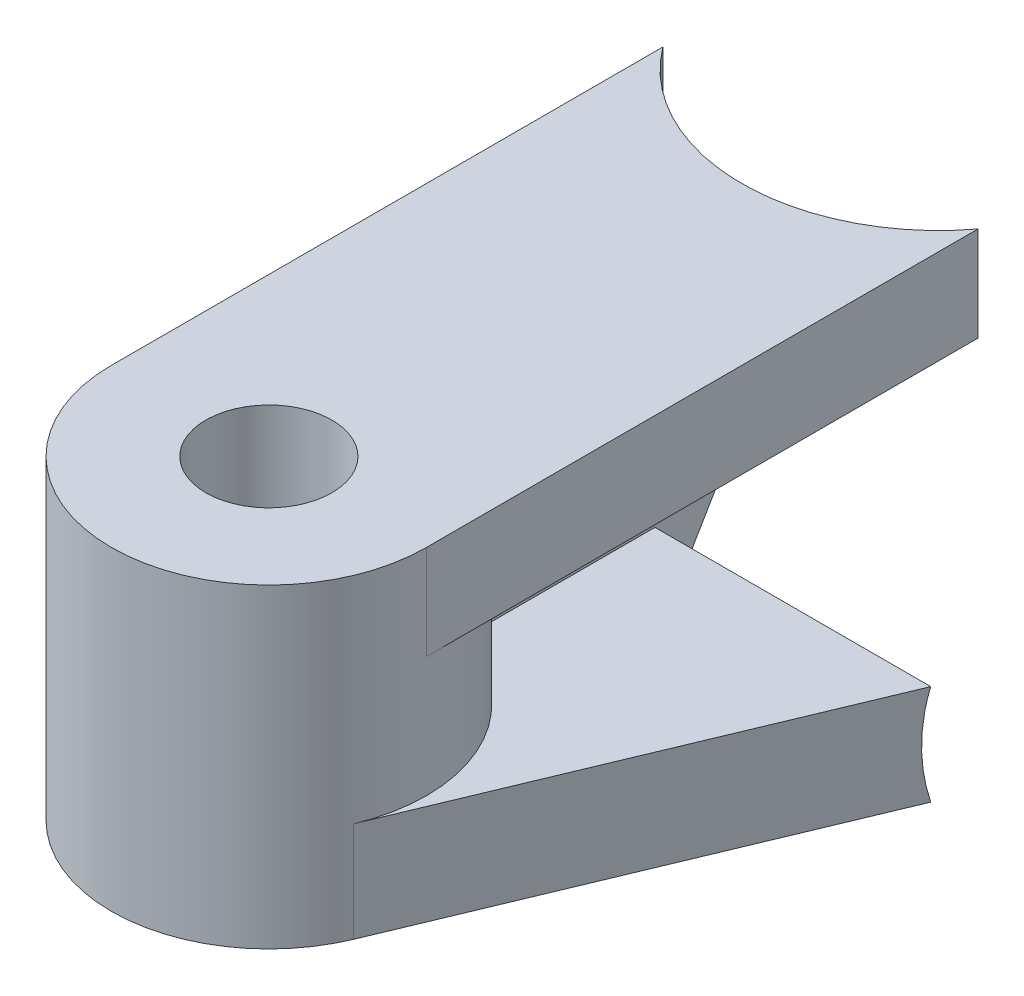
ISO-10303-21;
HEADER;
FILE_DESCRIPTION(('STEP AP214'),'2;1');
FILE_NAME('part.step','',(''),(''),'','','');
FILE_SCHEMA(('AUTOMOTIVE_DESIGN { 1 0 10303 214 1 1 1 1 }'));
ENDSEC;
DATA;
#1=APPLICATION_CONTEXT('core data for automotive mechanical design processes');
#2=APPLICATION_PROTOCOL_DEFINITION('international standard','automotive_design',2000,#1);
#3=PRODUCT_CONTEXT('',#1,'mechanical');
#4=PRODUCT('Part','Part','',(#3));
#5=PRODUCT_RELATED_PRODUCT_CATEGORY('part','',(#4));
#6=PRODUCT_DEFINITION_FORMATION('','',#4);
#7=PRODUCT_DEFINITION_CONTEXT('part definition',#1,'design');
#8=PRODUCT_DEFINITION('design','',#6,#7);
#9=PRODUCT_DEFINITION_SHAPE('','',#8);
#10=(LENGTH_UNIT() NAMED_UNIT(*) SI_UNIT(.MILLI.,.METRE.));
#11=(NAMED_UNIT(*) PLANE_ANGLE_UNIT() SI_UNIT($,.RADIAN.));
#12=(NAMED_UNIT(*) SI_UNIT($,.STERADIAN.) SOLID_ANGLE_UNIT());
#13=UNCERTAINTY_MEASURE_WITH_UNIT(LENGTH_MEASURE(1.E-05),#10,'distance_accuracy_value','');
#14=(GEOMETRIC_REPRESENTATION_CONTEXT(3) GLOBAL_UNCERTAINTY_ASSIGNED_CONTEXT((#13)) GLOBAL_UNIT_ASSIGNED_CONTEXT((#10,
#11,#12)) REPRESENTATION_CONTEXT('',''));
#15=CARTESIAN_POINT('',(0.,0.,0.));
#16=DIRECTION('',(0.,0.,1.));
#17=DIRECTION('',(1.,0.,0.));
#18=AXIS2_PLACEMENT_3D('',#15,#16,#17);
#19=CARTESIAN_POINT('',(0.,6.35,0.));
#20=DIRECTION('',(0.,1.,0.));
#21=DIRECTION('',(0.,0.,1.));
#22=AXIS2_PLACEMENT_3D('',#19,#20,#21);
#23=PLANE('',#22);
#24=DIRECTION('',(0.,0.,-1.));
#25=VECTOR('',#24,1.);
#26=CARTESIAN_POINT('',(22.5,6.35,0.));
#27=LINE('',#26,#25);
#28=CARTESIAN_POINT('',(22.5,6.35,12.3175416344815));
#29=VERTEX_POINT('',#28);
#30=CARTESIAN_POINT('',(22.5,6.35,0.));
#31=VERTEX_POINT('',#30);
#32=EDGE_CURVE('E93',#29,#31,#27,.T.);
#33=ORIENTED_EDGE('',*,*,#32,.F.);
#34=CARTESIAN_POINT('',(20.,6.35,22.));
#35=DIRECTION('',(0.,1.,0.));
#36=DIRECTION('',(0.,0.,1.));
#37=AXIS2_PLACEMENT_3D('',#34,#35,#36);
#38=CIRCLE('',#37,10.);
#39=CARTESIAN_POINT('',(29.2307692307692,6.35,25.8461538461538));
#40=VERTEX_POINT('',#39);
#41=EDGE_CURVE('E393',#40,#29,#38,.T.);
#42=ORIENTED_EDGE('',*,*,#41,.F.);
#43=DIRECTION('',(0.384615384615385,0.,-0.923076923076923));
#44=VECTOR('',#43,1.);
#45=CARTESIAN_POINT('',(34.0828402366864,6.35,14.2011834319527));
#46=LINE('',#45,#44);
#47=CARTESIAN_POINT('',(40.,6.35,0.));
#48=VERTEX_POINT('',#47);
#49=EDGE_CURVE('E389',#40,#48,#46,.T.);
#50=ORIENTED_EDGE('',*,*,#49,.T.);
#51=DIRECTION('',(1.,0.,0.));
#52=VECTOR('',#51,1.);
#53=CARTESIAN_POINT('',(0.,6.35,0.));
#54=LINE('',#53,#52);
#55=EDGE_CURVE('E180',#31,#48,#54,.T.);
#56=ORIENTED_EDGE('',*,*,#55,.F.);
#57=EDGE_LOOP('',(#33,#42,#50,#56));
#58=FACE_BOUND('',#57,.T.);
#59=ADVANCED_FACE('F61',(#58),#23,.T.);
#60=CARTESIAN_POINT('',(40.,3.175,-12.0900527294135));
#61=DIRECTION('',(-1.,0.,0.));
#62=DIRECTION('',(0.,0.,1.));
#63=AXIS2_PLACEMENT_3D('',#60,#61,#62);
#64=CYLINDRICAL_SURFACE('',#63,12.5);
#65=CARTESIAN_POINT('',(22.5,3.175,-12.0900527294135));
#66=DIRECTION('',(1.,0.,0.));
#67=DIRECTION('',(0.,0.,-1.));
#68=AXIS2_PLACEMENT_3D('',#65,#66,#67);
#69=CIRCLE('',#68,12.5);
#70=CARTESIAN_POINT('',(22.5,0.,0.));
#71=VERTEX_POINT('',#70);
#72=EDGE_CURVE('E188',#31,#71,#69,.T.);
#73=ORIENTED_EDGE('',*,*,#72,.F.);
#74=ORIENTED_EDGE('',*,*,#55,.T.);
#75=CARTESIAN_POINT('',(45.037521970589,3.175,-12.0900527294135));
#76=DIRECTION('',(-0.923076923076923,0.,-0.384615384615385));
#77=DIRECTION('',(-0.384615384615385,0.,0.923076923076923));
#78=AXIS2_PLACEMENT_3D('',#75,#76,#77);
#79=ELLIPSE('',#78,13.5416666666667,12.5);
#80=CARTESIAN_POINT('',(40.,0.,0.));
#81=VERTEX_POINT('',#80);
#82=EDGE_CURVE('E404',#48,#81,#79,.F.);
#83=ORIENTED_EDGE('',*,*,#82,.T.);
#84=DIRECTION('',(1.,0.,0.));
#85=VECTOR('',#84,1.);
#86=CARTESIAN_POINT('',(0.,0.,0.));
#87=LINE('',#86,#85);
#88=EDGE_CURVE('E374',#71,#81,#87,.T.);
#89=ORIENTED_EDGE('',*,*,#88,.F.);
#90=EDGE_LOOP('',(#73,#74,#83,#89));
#91=FACE_BOUND('',#90,.T.);
#92=ADVANCED_FACE('F310',(#91),#64,.F.);
#93=CARTESIAN_POINT('',(0.,14.,0.));
#94=DIRECTION('',(0.,1.,0.));
#95=DIRECTION('',(0.,0.,1.));
#96=AXIS2_PLACEMENT_3D('',#93,#94,#95);
#97=PLANE('',#96);
#98=CARTESIAN_POINT('',(20.,14.,22.));
#99=DIRECTION('',(0.,1.,0.));
#100=DIRECTION('',(0.,0.,1.));
#101=AXIS2_PLACEMENT_3D('',#98,#99,#100);
#102=CIRCLE('',#101,10.);
#103=CARTESIAN_POINT('',(30.,14.,22.));
#104=VERTEX_POINT('',#103);
#105=CARTESIAN_POINT('',(22.5,14.,12.3175416344815));
#106=VERTEX_POINT('',#105);
#107=EDGE_CURVE('E288',#104,#106,#102,.T.);
#108=ORIENTED_EDGE('',*,*,#107,.T.);
#109=DIRECTION('',(0.,0.,1.));
#110=VECTOR('',#109,1.);
#111=CARTESIAN_POINT('',(22.5,14.,-8.25255128608411));
#112=LINE('',#111,#110);
#113=CARTESIAN_POINT('',(22.4999952078443,14.,-8.2525258221675));
#114=VERTEX_POINT('',#113);
#115=EDGE_CURVE('E345',#114,#106,#112,.T.);
#116=ORIENTED_EDGE('',*,*,#115,.F.);
#117=CARTESIAN_POINT('',(10.,14.,-13.));
#118=CARTESIAN_POINT('',(10.8730863929418,14.,-11.8358848094109));
#119=CARTESIAN_POINT('',(11.9906570094279,14.,-10.9031033735184));
#120=CARTESIAN_POINT('',(13.1075970751827,14.,-9.97084822742621));
#121=CARTESIAN_POINT('',(14.4098300562505,14.,-9.31966011250106));
#122=CARTESIAN_POINT('',(15.7110791890447,14.,-8.66896397582559));
#123=CARTESIAN_POINT('',(17.128088493158,14.,-8.33438763165338));
#124=CARTESIAN_POINT('',(18.5440272344953,14.,-8.00006406280082));
#125=CARTESIAN_POINT('',(20.,14.,-8.00000000000001));
#126=CARTESIAN_POINT('',(21.4548727655053,14.,-7.99993598559919));
#127=CARTESIAN_POINT('',(22.871911506842,14.,-8.33438763165338));
#128=CARTESIAN_POINT('',(24.2878796631609,14.,-8.66858659659798));
#129=CARTESIAN_POINT('',(25.5901699437495,14.,-9.31966011250106));
#130=CARTESIAN_POINT('',(26.8914763327769,14.,-9.97024173673637));
#131=CARTESIAN_POINT('',(28.0093429905721,14.,-10.9031033735184));
#132=CARTESIAN_POINT('',(29.126579133298,14.,-11.8354388443973));
#133=CARTESIAN_POINT('',(30.,14.,-13.));
#134=B_SPLINE_CURVE_WITH_KNOTS('',2,(#117,#118,#119,#120,#121,#122,#123,#124,#125,#126,#127,
#128,#129,#130,#131,#132,#133),.UNSPECIFIED.,.F.,.F.,(3,2,2,2,2,2,2,2,3),(0.,0.125,0.25,0.375,
0.5,0.625,0.75,0.875,1.),.UNSPECIFIED.);
#135=CARTESIAN_POINT('',(30.,14.,-13.));
#136=VERTEX_POINT('',#135);
#137=EDGE_CURVE('E281',#114,#136,#134,.T.);
#138=ORIENTED_EDGE('',*,*,#137,.T.);
#139=DIRECTION('',(0.,0.,-1.));
#140=VECTOR('',#139,1.);
#141=CARTESIAN_POINT('',(30.,14.,0.));
#142=LINE('',#141,#140);
#143=EDGE_CURVE('E441',#104,#136,#142,.T.);
#144=ORIENTED_EDGE('',*,*,#143,.F.);
#145=EDGE_LOOP('',(#108,#116,#138,#144));
#146=FACE_BOUND('',#145,.T.);
#147=ADVANCED_FACE('F258',(#146),#97,.F.);
#148=CARTESIAN_POINT('',(20.,20.,22.));
#149=DIRECTION('',(0.,-1.,0.));
#150=DIRECTION('',(0.,0.,-1.));
#151=AXIS2_PLACEMENT_3D('',#148,#149,#150);
#152=CYLINDRICAL_SURFACE('',#151,10.);
#153=ORIENTED_EDGE('',*,*,#41,.T.);
#154=DIRECTION('',(0.,1.,0.));
#155=VECTOR('',#154,1.);
#156=CARTESIAN_POINT('',(22.5,0.,12.3175416344815));
#157=LINE('',#156,#155);
#158=EDGE_CURVE('E207',#29,#106,#157,.T.);
#159=ORIENTED_EDGE('',*,*,#158,.T.);
#160=ORIENTED_EDGE('',*,*,#107,.F.);
#161=DIRECTION('',(0.,1.,0.));
#162=VECTOR('',#161,1.);
#163=CARTESIAN_POINT('',(30.,14.,22.));
#164=LINE('',#163,#162);
#165=CARTESIAN_POINT('',(30.,20.,22.));
#166=VERTEX_POINT('',#165);
#167=EDGE_CURVE('E422',#104,#166,#164,.T.);
#168=ORIENTED_EDGE('',*,*,#167,.T.);
#169=CARTESIAN_POINT('',(20.,20.,22.));
#170=DIRECTION('',(0.,1.,0.));
#171=DIRECTION('',(0.,0.,1.));
#172=AXIS2_PLACEMENT_3D('',#169,#170,#171);
#173=CIRCLE('',#172,10.);
#174=CARTESIAN_POINT('',(10.,20.,22.));
#175=VERTEX_POINT('',#174);
#176=EDGE_CURVE('E405',#175,#166,#173,.T.);
#177=ORIENTED_EDGE('',*,*,#176,.F.);
#178=DIRECTION('',(0.,1.,0.));
#179=VECTOR('',#178,1.);
#180=CARTESIAN_POINT('',(10.,14.,22.));
#181=LINE('',#180,#179);
#182=CARTESIAN_POINT('',(10.,14.,22.));
#183=VERTEX_POINT('',#182);
#184=EDGE_CURVE('E418',#183,#175,#181,.T.);
#185=ORIENTED_EDGE('',*,*,#184,.F.);
#186=CARTESIAN_POINT('',(17.5,14.,12.3175416344815));
#187=VERTEX_POINT('',#186);
#188=EDGE_CURVE('E367',#187,#183,#102,.T.);
#189=ORIENTED_EDGE('',*,*,#188,.F.);
#190=DIRECTION('',(0.,1.,0.));
#191=VECTOR('',#190,1.);
#192=CARTESIAN_POINT('',(17.5,0.,12.3175416344815));
#193=LINE('',#192,#191);
#194=CARTESIAN_POINT('',(17.5,6.35,12.3175416344815));
#195=VERTEX_POINT('',#194);
#196=EDGE_CURVE('E85',#195,#187,#193,.T.);
#197=ORIENTED_EDGE('',*,*,#196,.F.);
#198=CARTESIAN_POINT('',(10.7692307692308,6.35,25.8461538461539));
#199=VERTEX_POINT('',#198);
#200=EDGE_CURVE('E185',#195,#199,#38,.T.);
#201=ORIENTED_EDGE('',*,*,#200,.T.);
#202=DIRECTION('',(0.,-1.,0.));
#203=VECTOR('',#202,1.);
#204=CARTESIAN_POINT('',(10.7692307692308,6.35,25.8461538461539));
#205=LINE('',#204,#203);
#206=CARTESIAN_POINT('',(10.7692307692308,0.,25.8461538461539));
#207=VERTEX_POINT('',#206);
#208=EDGE_CURVE('E77',#199,#207,#205,.T.);
#209=ORIENTED_EDGE('',*,*,#208,.T.);
#210=CARTESIAN_POINT('',(20.,0.,22.));
#211=DIRECTION('',(0.,1.,0.));
#212=DIRECTION('',(0.,0.,1.));
#213=AXIS2_PLACEMENT_3D('',#210,#211,#212);
#214=CIRCLE('',#213,10.);
#215=CARTESIAN_POINT('',(29.2307692307692,0.,25.8461538461538));
#216=VERTEX_POINT('',#215);
#217=EDGE_CURVE('E396',#207,#216,#214,.T.);
#218=ORIENTED_EDGE('',*,*,#217,.T.);
#219=DIRECTION('',(0.,-1.,0.));
#220=VECTOR('',#219,1.);
#221=CARTESIAN_POINT('',(29.2307692307692,6.35,25.8461538461538));
#222=LINE('',#221,#220);
#223=EDGE_CURVE('E12',#40,#216,#222,.T.);
#224=ORIENTED_EDGE('',*,*,#223,.F.);
#225=EDGE_LOOP('',(#153,#159,#160,#168,#177,#185,#189,#197,#201,#209,#218,#224));
#226=FACE_BOUND('',#225,.T.);
#227=ADVANCED_FACE('F315',(#226),#152,.T.);
#228=CARTESIAN_POINT('',(34.0828402366864,6.35,14.2011834319527));
#229=DIRECTION('',(-0.923076923076923,0.,-0.384615384615385));
#230=DIRECTION('',(-0.384615384615385,0.,0.923076923076923));
#231=AXIS2_PLACEMENT_3D('',#228,#229,#230);
#232=PLANE('',#231);
#233=ORIENTED_EDGE('',*,*,#82,.F.);
#234=ORIENTED_EDGE('',*,*,#49,.F.);
#235=ORIENTED_EDGE('',*,*,#223,.T.);
#236=DIRECTION('',(0.384615384615385,0.,-0.923076923076923));
#237=VECTOR('',#236,1.);
#238=CARTESIAN_POINT('',(34.0828402366864,0.,14.2011834319527));
#239=LINE('',#238,#237);
#240=EDGE_CURVE('E378',#216,#81,#239,.T.);
#241=ORIENTED_EDGE('',*,*,#240,.T.);
#242=EDGE_LOOP('',(#233,#234,#235,#241));
#243=FACE_BOUND('',#242,.T.);
#244=ADVANCED_FACE('F63',(#243),#232,.F.);
#245=CARTESIAN_POINT('',(0.,6.35,0.));
#246=DIRECTION('',(0.923076923076923,0.,-0.384615384615385));
#247=DIRECTION('',(-0.384615384615385,0.,-0.923076923076923));
#248=AXIS2_PLACEMENT_3D('',#245,#246,#247);
#249=PLANE('',#248);
#250=CARTESIAN_POINT('',(-5.03752197058897,3.175,-12.0900527294135));
#251=DIRECTION('',(0.923076923076923,0.,-0.384615384615385));
#252=DIRECTION('',(-0.384615384615385,0.,-0.923076923076923));
#253=AXIS2_PLACEMENT_3D('',#250,#251,#252);
#254=ELLIPSE('',#253,13.5416666666667,12.5);
#255=CARTESIAN_POINT('',(0.,0.,0.));
#256=VERTEX_POINT('',#255);
#257=CARTESIAN_POINT('',(0.,6.35,0.));
#258=VERTEX_POINT('',#257);
#259=EDGE_CURVE('E174',#256,#258,#254,.F.);
#260=ORIENTED_EDGE('',*,*,#259,.F.);
#261=DIRECTION('',(0.384615384615385,0.,0.923076923076923));
#262=VECTOR('',#261,1.);
#263=CARTESIAN_POINT('',(0.,0.,0.));
#264=LINE('',#263,#262);
#265=EDGE_CURVE('E373',#256,#207,#264,.T.);
#266=ORIENTED_EDGE('',*,*,#265,.T.);
#267=ORIENTED_EDGE('',*,*,#208,.F.);
#268=DIRECTION('',(0.384615384615385,0.,0.923076923076923));
#269=VECTOR('',#268,1.);
#270=CARTESIAN_POINT('',(0.,6.35,0.));
#271=LINE('',#270,#269);
#272=EDGE_CURVE('E179',#258,#199,#271,.T.);
#273=ORIENTED_EDGE('',*,*,#272,.F.);
#274=EDGE_LOOP('',(#260,#266,#267,#273));
#275=FACE_BOUND('',#274,.T.);
#276=ADVANCED_FACE('F324',(#275),#249,.F.);
#277=DIRECTION('',(0.,0.,1.));
#278=VECTOR('',#277,1.);
#279=CARTESIAN_POINT('',(17.5,6.35,0.));
#280=LINE('',#279,#278);
#281=CARTESIAN_POINT('',(17.5,6.35,0.));
#282=VERTEX_POINT('',#281);
#283=EDGE_CURVE('E183',#282,#195,#280,.T.);
#284=ORIENTED_EDGE('',*,*,#283,.F.);
#285=EDGE_CURVE('E167',#258,#282,#54,.T.);
#286=ORIENTED_EDGE('',*,*,#285,.F.);
#287=ORIENTED_EDGE('',*,*,#272,.T.);
#288=ORIENTED_EDGE('',*,*,#200,.F.);
#289=EDGE_LOOP('',(#284,#286,#287,#288));
#290=FACE_BOUND('',#289,.T.);
#291=ADVANCED_FACE('F184',(#290),#23,.T.);
#292=CARTESIAN_POINT('',(0.,0.,0.));
#293=DIRECTION('',(0.,1.,0.));
#294=DIRECTION('',(0.,0.,1.));
#295=AXIS2_PLACEMENT_3D('',#292,#293,#294);
#296=PLANE('',#295);
#297=DIRECTION('',(1.,0.,0.));
#298=VECTOR('',#297,1.);
#299=CARTESIAN_POINT('',(22.5,0.,0.));
#300=LINE('',#299,#298);
#301=CARTESIAN_POINT('',(17.5,0.,0.));
#302=VERTEX_POINT('',#301);
#303=EDGE_CURVE('E219',#302,#71,#300,.T.);
#304=ORIENTED_EDGE('',*,*,#303,.T.);
#305=ORIENTED_EDGE('',*,*,#88,.T.);
#306=ORIENTED_EDGE('',*,*,#240,.F.);
#307=ORIENTED_EDGE('',*,*,#217,.F.);
#308=ORIENTED_EDGE('',*,*,#265,.F.);
#309=EDGE_CURVE('E370',#256,#302,#87,.T.);
#310=ORIENTED_EDGE('',*,*,#309,.T.);
#311=EDGE_LOOP('',(#304,#305,#306,#307,#308,#310));
#312=FACE_BOUND('',#311,.T.);
#313=CARTESIAN_POINT('',(20.,0.,22.));
#314=DIRECTION('',(0.,1.,0.));
#315=DIRECTION('',(0.,0.,1.));
#316=AXIS2_PLACEMENT_3D('',#313,#314,#315);
#317=CIRCLE('',#316,4.);
#318=CARTESIAN_POINT('',(20.,0.,26.));
#319=VERTEX_POINT('',#318);
#320=EDGE_CURVE('E400',#319,#319,#317,.T.);
#321=ORIENTED_EDGE('',*,*,#320,.T.);
#322=EDGE_LOOP('',(#321));
#323=FACE_BOUND('',#322,.T.);
#324=ADVANCED_FACE('F320',(#312,#323),#296,.F.);
#325=CARTESIAN_POINT('',(20.,20.,22.));
#326=DIRECTION('',(0.,-1.,0.));
#327=DIRECTION('',(0.,0.,-1.));
#328=AXIS2_PLACEMENT_3D('',#325,#326,#327);
#329=CYLINDRICAL_SURFACE('',#328,4.);
#330=CARTESIAN_POINT('',(20.,20.,22.));
#331=DIRECTION('',(0.,1.,0.));
#332=DIRECTION('',(0.,0.,1.));
#333=AXIS2_PLACEMENT_3D('',#330,#331,#332);
#334=CIRCLE('',#333,4.);
#335=CARTESIAN_POINT('',(20.,20.,26.));
#336=VERTEX_POINT('',#335);
#337=EDGE_CURVE('E399',#336,#336,#334,.T.);
#338=ORIENTED_EDGE('',*,*,#337,.T.);
#339=EDGE_LOOP('',(#338));
#340=FACE_BOUND('',#339,.T.);
#341=ORIENTED_EDGE('',*,*,#320,.F.);
#342=EDGE_LOOP('',(#341));
#343=FACE_BOUND('',#342,.T.);
#344=ADVANCED_FACE('F313',(#340,#343),#329,.F.);
#345=CARTESIAN_POINT('',(0.,20.,0.));
#346=DIRECTION('',(0.,1.,0.));
#347=DIRECTION('',(0.,0.,1.));
#348=AXIS2_PLACEMENT_3D('',#345,#346,#347);
#349=PLANE('',#348);
#350=ORIENTED_EDGE('',*,*,#337,.F.);
#351=EDGE_LOOP('',(#350));
#352=FACE_BOUND('',#351,.T.);
#353=ORIENTED_EDGE('',*,*,#176,.T.);
#354=DIRECTION('',(0.,0.,-1.));
#355=VECTOR('',#354,1.);
#356=CARTESIAN_POINT('',(30.,20.,0.));
#357=LINE('',#356,#355);
#358=CARTESIAN_POINT('',(30.,20.,-13.));
#359=VERTEX_POINT('',#358);
#360=EDGE_CURVE('E427',#166,#359,#357,.T.);
#361=ORIENTED_EDGE('',*,*,#360,.T.);
#362=CARTESIAN_POINT('',(20.,20.,-20.5));
#363=DIRECTION('',(0.,1.,0.));
#364=DIRECTION('',(0.,0.,1.));
#365=AXIS2_PLACEMENT_3D('',#362,#363,#364);
#366=CIRCLE('',#365,12.5);
#367=CARTESIAN_POINT('',(10.,20.,-13.));
#368=VERTEX_POINT('',#367);
#369=EDGE_CURVE('E357',#368,#359,#366,.T.);
#370=ORIENTED_EDGE('',*,*,#369,.F.);
#371=DIRECTION('',(0.,0.,-1.));
#372=VECTOR('',#371,1.);
#373=CARTESIAN_POINT('',(10.,20.,0.));
#374=LINE('',#373,#372);
#375=EDGE_CURVE('E361',#175,#368,#374,.T.);
#376=ORIENTED_EDGE('',*,*,#375,.F.);
#377=EDGE_LOOP('',(#353,#361,#370,#376));
#378=FACE_BOUND('',#377,.T.);
#379=ADVANCED_FACE('F309',(#352,#378),#349,.T.);
#380=CARTESIAN_POINT('',(17.5,3.175,-12.0900527294135));
#381=DIRECTION('',(-1.,0.,0.));
#382=DIRECTION('',(0.,-1.,0.));
#383=AXIS2_PLACEMENT_3D('',#380,#381,#382);
#384=CIRCLE('',#383,12.5);
#385=EDGE_CURVE('E171',#302,#282,#384,.T.);
#386=ORIENTED_EDGE('',*,*,#385,.F.);
#387=ORIENTED_EDGE('',*,*,#309,.F.);
#388=ORIENTED_EDGE('',*,*,#259,.T.);
#389=ORIENTED_EDGE('',*,*,#285,.T.);
#390=EDGE_LOOP('',(#386,#387,#388,#389));
#391=FACE_BOUND('',#390,.T.);
#392=ADVANCED_FACE('F169',(#391),#64,.F.);
#393=CARTESIAN_POINT('',(20.,14.,-20.5));
#394=DIRECTION('',(0.,1.,0.));
#395=DIRECTION('',(0.,0.,1.));
#396=AXIS2_PLACEMENT_3D('',#393,#394,#395);
#397=CYLINDRICAL_SURFACE('',#396,12.5);
#398=ORIENTED_EDGE('',*,*,#369,.T.);
#399=DIRECTION('',(0.,1.,0.));
#400=VECTOR('',#399,1.);
#401=CARTESIAN_POINT('',(30.,14.,-13.));
#402=LINE('',#401,#400);
#403=EDGE_CURVE('E417',#136,#359,#402,.T.);
#404=ORIENTED_EDGE('',*,*,#403,.F.);
#405=ORIENTED_EDGE('',*,*,#137,.F.);
#406=CARTESIAN_POINT('',(17.5000069440747,14.,-8.25254986863288));
#407=CARTESIAN_POINT('',(17.7076172568718,13.9999737660391,-8.21016660633876));
#408=CARTESIAN_POINT('',(17.9163067086161,13.9999040307702,-8.17307199081617));
#409=CARTESIAN_POINT('',(18.3352652236179,13.9997780500353,-8.10953965536446));
#410=CARTESIAN_POINT('',(18.5455340117857,13.9997218022738,-8.08310012145171));
#411=CARTESIAN_POINT('',(18.9671452043781,13.9997232115955,-8.04094290563095));
#412=CARTESIAN_POINT('',(19.1784876168466,13.9997808695335,-8.02522530417286));
#413=CARTESIAN_POINT('',(19.601731424014,13.9999212171947,-8.0045497386506));
#414=CARTESIAN_POINT('',(19.8136329004422,14.0000039108049,-7.99959344629902));
#415=CARTESIAN_POINT('',(20.2329940782418,13.9999952952731,-8.00044964543317));
#416=CARTESIAN_POINT('',(20.4404542677135,13.9999075783171,-8.0060397514046));
#417=CARTESIAN_POINT('',(20.854872792389,13.9997695119189,-8.027540244738));
#418=CARTESIAN_POINT('',(21.0618310422698,13.999719168439,-8.04345227803077));
#419=CARTESIAN_POINT('',(21.4749603056102,13.9997257289039,-8.08558695030029));
#420=CARTESIAN_POINT('',(21.6811299886579,13.999782768874,-8.11182263318635));
#421=CARTESIAN_POINT('',(22.0918754712212,13.9999075495,-8.17452871285188));
#422=CARTESIAN_POINT('',(22.2964515038166,13.9999752885591,-8.21099758295107));
#423=CARTESIAN_POINT('',(22.49999040966,14.,-8.25254932846815));
#424=B_SPLINE_CURVE_WITH_KNOTS('',3,(#406,#407,#408,#409,#410,#411,#412,#413,#414,#415,#416,
#417,#418,#419,#420,#421,#422,#423),.UNSPECIFIED.,.F.,.F.,(4,2,2,2,2,2,2,2,4),(0.,
0.635608038098272,1.27110782079333,1.90661237178433,2.54221563799301,3.16456591516412,
3.78701545648868,4.41025399989119,5.03339961226894),.UNSPECIFIED.);
#425=CARTESIAN_POINT('',(17.499999986999,14.,-8.2525157859631));
#426=VERTEX_POINT('',#425);
#427=EDGE_CURVE('E199',#426,#114,#424,.T.);
#428=ORIENTED_EDGE('',*,*,#427,.F.);
#429=CARTESIAN_POINT('',(10.,14.,-13.));
#430=CARTESIAN_POINT('',(10.8730863929418,14.,-11.8358848094109));
#431=CARTESIAN_POINT('',(11.9906570094279,14.,-10.9031033735184));
#432=CARTESIAN_POINT('',(13.1075970751827,14.,-9.97084822742621));
#433=CARTESIAN_POINT('',(14.4098300562505,14.,-9.31966011250106));
#434=CARTESIAN_POINT('',(15.7110791890447,14.,-8.66896397582559));
#435=CARTESIAN_POINT('',(17.128088493158,14.,-8.33438763165338));
#436=CARTESIAN_POINT('',(18.5440272344953,14.,-8.00006406280082));
#437=CARTESIAN_POINT('',(20.,14.,-8.00000000000001));
#438=CARTESIAN_POINT('',(21.4548727655053,14.,-7.99993598559919));
#439=CARTESIAN_POINT('',(22.871911506842,14.,-8.33438763165338));
#440=CARTESIAN_POINT('',(24.2878796631609,14.,-8.66858659659798));
#441=CARTESIAN_POINT('',(25.5901699437495,14.,-9.31966011250106));
#442=CARTESIAN_POINT('',(26.8914763327769,14.,-9.97024173673637));
#443=CARTESIAN_POINT('',(28.0093429905721,14.,-10.9031033735184));
#444=CARTESIAN_POINT('',(29.126579133298,14.,-11.8354388443973));
#445=CARTESIAN_POINT('',(30.,14.,-13.));
#446=B_SPLINE_CURVE_WITH_KNOTS('',2,(#429,#430,#431,#432,#433,#434,#435,#436,#437,#438,#439,
#440,#441,#442,#443,#444,#445),.UNSPECIFIED.,.F.,.F.,(3,2,2,2,2,2,2,2,3),(0.,0.125,0.25,0.375,
0.5,0.625,0.75,0.875,1.),.UNSPECIFIED.);
#447=CARTESIAN_POINT('',(10.,14.,-13.));
#448=VERTEX_POINT('',#447);
#449=EDGE_CURVE('E439',#448,#426,#446,.T.);
#450=ORIENTED_EDGE('',*,*,#449,.F.);
#451=DIRECTION('',(0.,1.,0.));
#452=VECTOR('',#451,1.);
#453=CARTESIAN_POINT('',(10.,14.,-13.));
#454=LINE('',#453,#452);
#455=EDGE_CURVE('E423',#448,#368,#454,.T.);
#456=ORIENTED_EDGE('',*,*,#455,.T.);
#457=EDGE_LOOP('',(#398,#404,#405,#428,#450,#456));
#458=FACE_BOUND('',#457,.T.);
#459=ADVANCED_FACE('F297',(#458),#397,.F.);
#460=CARTESIAN_POINT('',(30.,14.,0.));
#461=DIRECTION('',(1.,0.,0.));
#462=DIRECTION('',(0.,0.,-1.));
#463=AXIS2_PLACEMENT_3D('',#460,#461,#462);
#464=PLANE('',#463);
#465=ORIENTED_EDGE('',*,*,#360,.F.);
#466=ORIENTED_EDGE('',*,*,#167,.F.);
#467=ORIENTED_EDGE('',*,*,#143,.T.);
#468=ORIENTED_EDGE('',*,*,#403,.T.);
#469=EDGE_LOOP('',(#465,#466,#467,#468));
#470=FACE_BOUND('',#469,.T.);
#471=ADVANCED_FACE('F259',(#470),#464,.T.);
#472=CARTESIAN_POINT('',(10.,14.,0.));
#473=DIRECTION('',(1.,0.,0.));
#474=DIRECTION('',(0.,0.,-1.));
#475=AXIS2_PLACEMENT_3D('',#472,#473,#474);
#476=PLANE('',#475);
#477=ORIENTED_EDGE('',*,*,#375,.T.);
#478=ORIENTED_EDGE('',*,*,#455,.F.);
#479=DIRECTION('',(0.,0.,-1.));
#480=VECTOR('',#479,1.);
#481=CARTESIAN_POINT('',(10.,14.,0.));
#482=LINE('',#481,#480);
#483=EDGE_CURVE('E294',#183,#448,#482,.T.);
#484=ORIENTED_EDGE('',*,*,#483,.F.);
#485=ORIENTED_EDGE('',*,*,#184,.T.);
#486=EDGE_LOOP('',(#477,#478,#484,#485));
#487=FACE_BOUND('',#486,.T.);
#488=ADVANCED_FACE('F256',(#487),#476,.F.);
#489=ORIENTED_EDGE('',*,*,#449,.T.);
#490=DIRECTION('',(0.,0.,-1.));
#491=VECTOR('',#490,1.);
#492=CARTESIAN_POINT('',(17.5,14.,-8.25255128608411));
#493=LINE('',#492,#491);
#494=EDGE_CURVE('E196',#187,#426,#493,.T.);
#495=ORIENTED_EDGE('',*,*,#494,.F.);
#496=ORIENTED_EDGE('',*,*,#188,.T.);
#497=ORIENTED_EDGE('',*,*,#483,.T.);
#498=EDGE_LOOP('',(#489,#495,#496,#497));
#499=FACE_BOUND('',#498,.T.);
#500=ADVANCED_FACE('F252',(#499),#97,.F.);
#501=CARTESIAN_POINT('',(22.5,0.,0.));
#502=DIRECTION('',(1.,0.,0.));
#503=DIRECTION('',(0.,0.,-1.));
#504=AXIS2_PLACEMENT_3D('',#501,#502,#503);
#505=PLANE('',#504);
#506=ORIENTED_EDGE('',*,*,#158,.F.);
#507=ORIENTED_EDGE('',*,*,#32,.T.);
#508=ORIENTED_EDGE('',*,*,#72,.T.);
#509=DIRECTION('',(0.,0.861469786918381,-0.507808828425421));
#510=VECTOR('',#509,1.);
#511=CARTESIAN_POINT('',(22.5,0.,0.));
#512=LINE('',#511,#510);
#513=EDGE_CURVE('E211',#71,#114,#512,.T.);
#514=ORIENTED_EDGE('',*,*,#513,.T.);
#515=ORIENTED_EDGE('',*,*,#115,.T.);
#516=EDGE_LOOP('',(#506,#507,#508,#514,#515));
#517=FACE_BOUND('',#516,.T.);
#518=ADVANCED_FACE('F243',(#517),#505,.T.);
#519=CARTESIAN_POINT('',(22.5,0.,0.));
#520=CARTESIAN_POINT('',(22.5,14.,-8.25255128608411));
#521=CARTESIAN_POINT('',(22.5,14.14,-8.33507679894495));
#522=CARTESIAN_POINT('',(21.6666666666667,0.,0.));
#523=CARTESIAN_POINT('',(21.6835034190723,14.,-8.08588461941745));
#524=CARTESIAN_POINT('',(21.6836717865963,14.14,-8.16674346561162));
#525=CARTESIAN_POINT('',(20.8333333333333,0.,0.));
#526=CARTESIAN_POINT('',(20.8418376202804,14.,-8.));
#527=CARTESIAN_POINT('',(20.8419226631498,14.14,-8.08));
#528=CARTESIAN_POINT('',(19.1666666666667,0.,0.));
#529=CARTESIAN_POINT('',(19.1581623797196,14.,-8.));
#530=CARTESIAN_POINT('',(19.1580773368502,14.14,-8.08));
#531=CARTESIAN_POINT('',(18.3333333333333,0.,0.));
#532=CARTESIAN_POINT('',(18.3164965809277,14.,-8.08588461941745));
#533=CARTESIAN_POINT('',(18.3163282134037,14.14,-8.16674346561162));
#534=CARTESIAN_POINT('',(17.5,0.,0.));
#535=CARTESIAN_POINT('',(17.5,14.,-8.25255128608411));
#536=CARTESIAN_POINT('',(17.5,14.14,-8.33507679894495));
#537=B_SPLINE_SURFACE_WITH_KNOTS('',3,1,((#519,#520,#521),(#522,#523,#524),(#525,#526,#527),
(#528,#529,#530),(#531,#532,#533),(#534,#535,#536)),.UNSPECIFIED.,.F.,.F.,.F.,(4,2,4),(2,1,2),
(0.,0.5,1.),(0.,1.,1.01),.UNSPECIFIED.);
#538=DIRECTION('',(0.,0.861469786918381,-0.507808828425421));
#539=VECTOR('',#538,1.);
#540=CARTESIAN_POINT('',(17.5,7.,-4.12627564304206));
#541=LINE('',#540,#539);
#542=EDGE_CURVE('E194',#302,#426,#541,.T.);
#543=ORIENTED_EDGE('',*,*,#303,.F.);
#544=ORIENTED_EDGE('',*,*,#542,.T.);
#545=ORIENTED_EDGE('',*,*,#427,.T.);
#546=ORIENTED_EDGE('',*,*,#513,.F.);
#547=EDGE_LOOP('',(#543,#544,#545,#546));
#548=FACE_BOUND('',#547,.T.);
#549=ADVANCED_FACE('F231',(#548),#537,.T.);
#550=CARTESIAN_POINT('',(17.5,0.,0.));
#551=DIRECTION('',(-1.,0.,0.));
#552=DIRECTION('',(0.,-1.,0.));
#553=AXIS2_PLACEMENT_3D('',#550,#551,#552);
#554=PLANE('',#553);
#555=ORIENTED_EDGE('',*,*,#385,.T.);
#556=ORIENTED_EDGE('',*,*,#283,.T.);
#557=ORIENTED_EDGE('',*,*,#196,.T.);
#558=ORIENTED_EDGE('',*,*,#494,.T.);
#559=ORIENTED_EDGE('',*,*,#542,.F.);
#560=EDGE_LOOP('',(#555,#556,#557,#558,#559));
#561=FACE_BOUND('',#560,.T.);
#562=ADVANCED_FACE('F191',(#561),#554,.T.);
#563=CLOSED_SHELL('',(#59,#92,#147,#227,#244,#276,#291,#324,#344,#379,#392,#459,#471,#488,#500,
#518,#549,#562));
#564=MANIFOLD_SOLID_BREP('B2',#563);
#565=ADVANCED_BREP_SHAPE_REPRESENTATION('',(#18,#564),#14);
#566=SHAPE_DEFINITION_REPRESENTATION(#9,#565);
ENDSEC;
END-ISO-10303-21;
